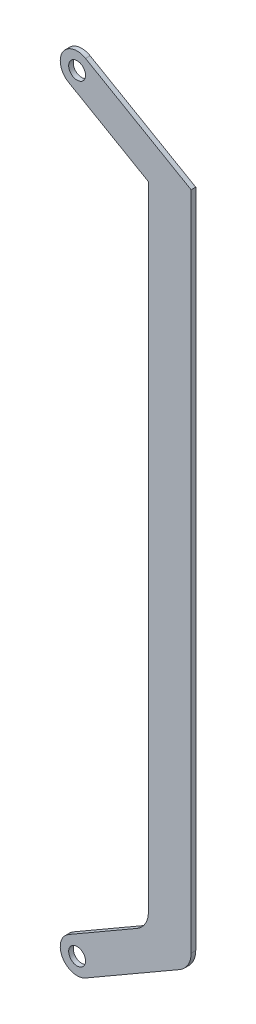
ISO-10303-21;
HEADER;
FILE_DESCRIPTION(('STEP AP214'),'2;1');
FILE_NAME('part.step','',(''),(''),'','','');
FILE_SCHEMA(('AUTOMOTIVE_DESIGN { 1 0 10303 214 1 1 1 1 }'));
ENDSEC;
DATA;
#1=APPLICATION_CONTEXT('core data for automotive mechanical design processes');
#2=APPLICATION_PROTOCOL_DEFINITION('international standard','automotive_design',2000,#1);
#3=PRODUCT_CONTEXT('',#1,'mechanical');
#4=PRODUCT('Part','Part','',(#3));
#5=PRODUCT_RELATED_PRODUCT_CATEGORY('part','',(#4));
#6=PRODUCT_DEFINITION_FORMATION('','',#4);
#7=PRODUCT_DEFINITION_CONTEXT('part definition',#1,'design');
#8=PRODUCT_DEFINITION('design','',#6,#7);
#9=PRODUCT_DEFINITION_SHAPE('','',#8);
#10=(LENGTH_UNIT() NAMED_UNIT(*) SI_UNIT(.MILLI.,.METRE.));
#11=(NAMED_UNIT(*) PLANE_ANGLE_UNIT() SI_UNIT($,.RADIAN.));
#12=(NAMED_UNIT(*) SI_UNIT($,.STERADIAN.) SOLID_ANGLE_UNIT());
#13=UNCERTAINTY_MEASURE_WITH_UNIT(LENGTH_MEASURE(1.E-05),#10,'distance_accuracy_value','');
#14=(GEOMETRIC_REPRESENTATION_CONTEXT(3) GLOBAL_UNCERTAINTY_ASSIGNED_CONTEXT((#13)) GLOBAL_UNIT_ASSIGNED_CONTEXT((#10,
#11,#12)) REPRESENTATION_CONTEXT('',''));
#15=CARTESIAN_POINT('',(0.,0.,0.));
#16=DIRECTION('',(0.,0.,1.));
#17=DIRECTION('',(1.,0.,0.));
#18=AXIS2_PLACEMENT_3D('',#15,#16,#17);
#19=CARTESIAN_POINT('',(249.953360513279,475.962931602702,3.));
#20=DIRECTION('',(0.,0.,1.));
#21=DIRECTION('',(1.,0.,0.));
#22=AXIS2_PLACEMENT_3D('',#19,#20,#21);
#23=PLANE('',#22);
#24=CARTESIAN_POINT('',(249.953360513279,475.962931602702,3.));
#25=DIRECTION('',(0.,0.,1.));
#26=DIRECTION('',(1.,0.,0.));
#27=AXIS2_PLACEMENT_3D('',#24,#25,#26);
#28=CIRCLE('',#27,5.50000000000002);
#29=CARTESIAN_POINT('',(255.453360513279,475.962931602702,3.));
#30=VERTEX_POINT('',#29);
#31=EDGE_CURVE('E156',#30,#30,#28,.T.);
#32=ORIENTED_EDGE('',*,*,#31,.F.);
#33=EDGE_LOOP('',(#32));
#34=FACE_BOUND('',#33,.T.);
#35=DIRECTION('',(0.,1.,0.));
#36=VECTOR('',#35,1.);
#37=CARTESIAN_POINT('',(324.289682363527,14.8395751491829,3.));
#38=LINE('',#37,#36);
#39=CARTESIAN_POINT('',(324.289682363527,14.8395751491828,3.));
#40=VERTEX_POINT('',#39);
#41=CARTESIAN_POINT('',(324.289682363527,445.746542094066,3.));
#42=VERTEX_POINT('',#41);
#43=EDGE_CURVE('E105',#40,#42,#38,.T.);
#44=ORIENTED_EDGE('',*,*,#43,.T.);
#45=DIRECTION('',(-0.866025403784438,0.5,0.));
#46=VECTOR('',#45,1.);
#47=CARTESIAN_POINT('',(324.289682363527,445.746542094066,3.));
#48=LINE('',#47,#46);
#49=CARTESIAN_POINT('',(255.453360513279,485.489211044331,3.));
#50=VERTEX_POINT('',#49);
#51=EDGE_CURVE('E241',#42,#50,#48,.T.);
#52=ORIENTED_EDGE('',*,*,#51,.T.);
#53=CARTESIAN_POINT('',(249.953360513279,475.962931602702,3.));
#54=DIRECTION('',(0.,0.,1.));
#55=DIRECTION('',(1.,0.,0.));
#56=AXIS2_PLACEMENT_3D('',#53,#54,#55);
#57=CIRCLE('',#56,11.);
#58=CARTESIAN_POINT('',(244.453360513279,466.436652161073,3.));
#59=VERTEX_POINT('',#58);
#60=EDGE_CURVE('E211',#50,#59,#57,.T.);
#61=ORIENTED_EDGE('',*,*,#60,.T.);
#62=DIRECTION('',(0.866025403784438,-0.5,0.));
#63=VECTOR('',#62,1.);
#64=CARTESIAN_POINT('',(244.453360513279,466.436652161073,3.));
#65=LINE('',#64,#63);
#66=CARTESIAN_POINT('',(296.414884740345,436.436652161073,3.));
#67=VERTEX_POINT('',#66);
#68=EDGE_CURVE('E231',#59,#67,#65,.T.);
#69=ORIENTED_EDGE('',*,*,#68,.T.);
#70=DIRECTION('',(0.,-1.,0.));
#71=VECTOR('',#70,1.);
#72=CARTESIAN_POINT('',(296.414884740345,436.436652161073,3.));
#73=LINE('',#72,#71);
#74=CARTESIAN_POINT('',(296.414884740345,24.149465082176,3.));
#75=VERTEX_POINT('',#74);
#76=EDGE_CURVE('E227',#67,#75,#73,.T.);
#77=ORIENTED_EDGE('',*,*,#76,.T.);
#78=CARTESIAN_POINT('',(281.414884740345,24.1494650821759,3.));
#79=DIRECTION('',(0.,0.,-1.));
#80=DIRECTION('',(1.,0.,0.));
#81=AXIS2_PLACEMENT_3D('',#78,#79,#80);
#82=CIRCLE('',#81,15.);
#83=CARTESIAN_POINT('',(288.914884740345,11.1590840254093,3.));
#84=VERTEX_POINT('',#83);
#85=EDGE_CURVE('E230',#75,#84,#82,.T.);
#86=ORIENTED_EDGE('',*,*,#85,.T.);
#87=DIRECTION('',(-0.866025403784439,-0.5,0.));
#88=VECTOR('',#87,1.);
#89=CARTESIAN_POINT('',(244.453360513279,-14.5107889556685,3.));
#90=LINE('',#89,#88);
#91=CARTESIAN_POINT('',(244.453360513279,-14.5107889556685,3.));
#92=VERTEX_POINT('',#91);
#93=EDGE_CURVE('E131',#84,#92,#90,.T.);
#94=ORIENTED_EDGE('',*,*,#93,.T.);
#95=CARTESIAN_POINT('',(249.953360513279,-24.0370683972973,3.));
#96=DIRECTION('',(0.,0.,1.));
#97=DIRECTION('',(-1.,0.,0.));
#98=AXIS2_PLACEMENT_3D('',#95,#96,#97);
#99=CIRCLE('',#98,11.);
#100=CARTESIAN_POINT('',(255.453360513279,-33.5633478389262,3.));
#101=VERTEX_POINT('',#100);
#102=EDGE_CURVE('E125',#92,#101,#99,.T.);
#103=ORIENTED_EDGE('',*,*,#102,.T.);
#104=DIRECTION('',(0.866025403784439,0.5,0.));
#105=VECTOR('',#104,1.);
#106=CARTESIAN_POINT('',(316.789682363527,1.8491940924162,3.));
#107=LINE('',#106,#105);
#108=CARTESIAN_POINT('',(316.789682363527,1.8491940924162,3.));
#109=VERTEX_POINT('',#108);
#110=EDGE_CURVE('E129',#101,#109,#107,.T.);
#111=ORIENTED_EDGE('',*,*,#110,.T.);
#112=CARTESIAN_POINT('',(309.289682363527,14.8395751491828,3.));
#113=DIRECTION('',(0.,0.,1.));
#114=DIRECTION('',(1.,0.,0.));
#115=AXIS2_PLACEMENT_3D('',#112,#113,#114);
#116=CIRCLE('',#115,15.);
#117=EDGE_CURVE('E57',#109,#40,#116,.T.);
#118=ORIENTED_EDGE('',*,*,#117,.T.);
#119=EDGE_LOOP('',(#44,#52,#61,#69,#77,#86,#94,#103,#111,#118));
#120=FACE_BOUND('',#119,.T.);
#121=CARTESIAN_POINT('',(249.953360513279,-24.0370683972977,3.));
#122=DIRECTION('',(0.,0.,1.));
#123=DIRECTION('',(1.,0.,0.));
#124=AXIS2_PLACEMENT_3D('',#121,#122,#123);
#125=CIRCLE('',#124,5.49999999999999);
#126=CARTESIAN_POINT('',(255.453360513279,-24.0370683972977,3.));
#127=VERTEX_POINT('',#126);
#128=EDGE_CURVE('E250',#127,#127,#125,.T.);
#129=ORIENTED_EDGE('',*,*,#128,.F.);
#130=EDGE_LOOP('',(#129));
#131=FACE_BOUND('',#130,.T.);
#132=ADVANCED_FACE('F39',(#34,#120,#131),#23,.T.);
#133=CARTESIAN_POINT('',(249.953360513279,475.962931602702,0.));
#134=DIRECTION('',(0.,0.,1.));
#135=DIRECTION('',(1.,0.,0.));
#136=AXIS2_PLACEMENT_3D('',#133,#134,#135);
#137=PLANE('',#136);
#138=DIRECTION('',(0.,1.,0.));
#139=VECTOR('',#138,1.);
#140=CARTESIAN_POINT('',(324.289682363527,445.746542094066,0.));
#141=LINE('',#140,#139);
#142=CARTESIAN_POINT('',(324.289682363527,14.8395751491828,0.));
#143=VERTEX_POINT('',#142);
#144=CARTESIAN_POINT('',(324.289682363527,445.746542094066,0.));
#145=VERTEX_POINT('',#144);
#146=EDGE_CURVE('E99',#143,#145,#141,.T.);
#147=ORIENTED_EDGE('',*,*,#146,.F.);
#148=CARTESIAN_POINT('',(309.289682363527,14.8395751491828,0.));
#149=DIRECTION('',(0.,0.,1.));
#150=DIRECTION('',(1.,0.,0.));
#151=AXIS2_PLACEMENT_3D('',#148,#149,#150);
#152=CIRCLE('',#151,15.);
#153=CARTESIAN_POINT('',(316.789682363527,1.8491940924162,0.));
#154=VERTEX_POINT('',#153);
#155=EDGE_CURVE('E178',#154,#143,#152,.T.);
#156=ORIENTED_EDGE('',*,*,#155,.F.);
#157=DIRECTION('',(0.866025403784439,0.5,0.));
#158=VECTOR('',#157,1.);
#159=CARTESIAN_POINT('',(316.789682363527,1.8491940924162,0.));
#160=LINE('',#159,#158);
#161=CARTESIAN_POINT('',(255.453360513279,-33.5633478389262,0.));
#162=VERTEX_POINT('',#161);
#163=EDGE_CURVE('E92',#162,#154,#160,.T.);
#164=ORIENTED_EDGE('',*,*,#163,.F.);
#165=CARTESIAN_POINT('',(249.953360513279,-24.0370683972973,0.));
#166=DIRECTION('',(0.,0.,1.));
#167=DIRECTION('',(-1.,0.,0.));
#168=AXIS2_PLACEMENT_3D('',#165,#166,#167);
#169=CIRCLE('',#168,11.);
#170=CARTESIAN_POINT('',(244.453360513279,-14.5107889556685,0.));
#171=VERTEX_POINT('',#170);
#172=EDGE_CURVE('E140',#171,#162,#169,.T.);
#173=ORIENTED_EDGE('',*,*,#172,.F.);
#174=DIRECTION('',(-0.866025403784439,-0.5,0.));
#175=VECTOR('',#174,1.);
#176=CARTESIAN_POINT('',(244.453360513279,-14.5107889556685,0.));
#177=LINE('',#176,#175);
#178=CARTESIAN_POINT('',(288.914884740345,11.1590840254093,0.));
#179=VERTEX_POINT('',#178);
#180=EDGE_CURVE('E171',#179,#171,#177,.T.);
#181=ORIENTED_EDGE('',*,*,#180,.F.);
#182=CARTESIAN_POINT('',(281.414884740345,24.1494650821759,0.));
#183=DIRECTION('',(0.,0.,-1.));
#184=DIRECTION('',(1.,0.,0.));
#185=AXIS2_PLACEMENT_3D('',#182,#183,#184);
#186=CIRCLE('',#185,15.);
#187=CARTESIAN_POINT('',(296.414884740345,24.149465082176,0.));
#188=VERTEX_POINT('',#187);
#189=EDGE_CURVE('E168',#188,#179,#186,.T.);
#190=ORIENTED_EDGE('',*,*,#189,.F.);
#191=DIRECTION('',(0.,-1.,0.));
#192=VECTOR('',#191,1.);
#193=CARTESIAN_POINT('',(296.414884740345,436.436652161073,0.));
#194=LINE('',#193,#192);
#195=CARTESIAN_POINT('',(296.414884740345,436.436652161073,0.));
#196=VERTEX_POINT('',#195);
#197=EDGE_CURVE('E165',#196,#188,#194,.T.);
#198=ORIENTED_EDGE('',*,*,#197,.F.);
#199=DIRECTION('',(0.866025403784438,-0.5,0.));
#200=VECTOR('',#199,1.);
#201=CARTESIAN_POINT('',(244.453360513279,466.436652161073,0.));
#202=LINE('',#201,#200);
#203=CARTESIAN_POINT('',(244.453360513279,466.436652161073,0.));
#204=VERTEX_POINT('',#203);
#205=EDGE_CURVE('E162',#204,#196,#202,.T.);
#206=ORIENTED_EDGE('',*,*,#205,.F.);
#207=CARTESIAN_POINT('',(249.953360513279,475.962931602702,0.));
#208=DIRECTION('',(0.,0.,1.));
#209=DIRECTION('',(1.,0.,0.));
#210=AXIS2_PLACEMENT_3D('',#207,#208,#209);
#211=CIRCLE('',#210,11.);
#212=CARTESIAN_POINT('',(255.453360513279,485.489211044331,0.));
#213=VERTEX_POINT('',#212);
#214=EDGE_CURVE('E159',#213,#204,#211,.T.);
#215=ORIENTED_EDGE('',*,*,#214,.F.);
#216=DIRECTION('',(-0.866025403784438,0.5,0.));
#217=VECTOR('',#216,1.);
#218=CARTESIAN_POINT('',(324.289682363527,445.746542094066,0.));
#219=LINE('',#218,#217);
#220=EDGE_CURVE('E155',#145,#213,#219,.T.);
#221=ORIENTED_EDGE('',*,*,#220,.F.);
#222=EDGE_LOOP('',(#147,#156,#164,#173,#181,#190,#198,#206,#215,#221));
#223=FACE_BOUND('',#222,.T.);
#224=CARTESIAN_POINT('',(249.953360513279,475.962931602702,0.));
#225=DIRECTION('',(0.,0.,1.));
#226=DIRECTION('',(1.,0.,0.));
#227=AXIS2_PLACEMENT_3D('',#224,#225,#226);
#228=CIRCLE('',#227,5.50000000000002);
#229=CARTESIAN_POINT('',(255.453360513279,475.962931602702,0.));
#230=VERTEX_POINT('',#229);
#231=EDGE_CURVE('E246',#230,#230,#228,.T.);
#232=ORIENTED_EDGE('',*,*,#231,.T.);
#233=EDGE_LOOP('',(#232));
#234=FACE_BOUND('',#233,.T.);
#235=CARTESIAN_POINT('',(249.953360513279,-24.0370683972977,0.));
#236=DIRECTION('',(0.,0.,1.));
#237=DIRECTION('',(1.,0.,0.));
#238=AXIS2_PLACEMENT_3D('',#235,#236,#237);
#239=CIRCLE('',#238,5.49999999999999);
#240=CARTESIAN_POINT('',(255.453360513279,-24.0370683972977,0.));
#241=VERTEX_POINT('',#240);
#242=EDGE_CURVE('E254',#241,#241,#239,.T.);
#243=ORIENTED_EDGE('',*,*,#242,.T.);
#244=EDGE_LOOP('',(#243));
#245=FACE_BOUND('',#244,.T.);
#246=ADVANCED_FACE('F215',(#223,#234,#245),#137,.F.);
#247=CARTESIAN_POINT('',(324.289682363527,445.746542094066,3.));
#248=DIRECTION('',(-1.,0.,0.));
#249=DIRECTION('',(0.,-1.,0.));
#250=AXIS2_PLACEMENT_3D('',#247,#248,#249);
#251=PLANE('',#250);
#252=ORIENTED_EDGE('',*,*,#146,.T.);
#253=DIRECTION('',(0.,0.,-1.));
#254=VECTOR('',#253,1.);
#255=CARTESIAN_POINT('',(324.289682363527,445.746542094066,3.));
#256=LINE('',#255,#254);
#257=EDGE_CURVE('E11',#42,#145,#256,.T.);
#258=ORIENTED_EDGE('',*,*,#257,.F.);
#259=ORIENTED_EDGE('',*,*,#43,.F.);
#260=DIRECTION('',(0.,0.,-1.));
#261=VECTOR('',#260,1.);
#262=CARTESIAN_POINT('',(324.289682363527,14.8395751491828,3.));
#263=LINE('',#262,#261);
#264=EDGE_CURVE('E149',#40,#143,#263,.T.);
#265=ORIENTED_EDGE('',*,*,#264,.T.);
#266=EDGE_LOOP('',(#252,#258,#259,#265));
#267=FACE_BOUND('',#266,.T.);
#268=ADVANCED_FACE('F41',(#267),#251,.F.);
#269=CARTESIAN_POINT('',(324.289682363527,445.746542094066,3.));
#270=DIRECTION('',(-0.5,-0.866025403784438,0.));
#271=DIRECTION('',(0.866025403784438,-0.5,0.));
#272=AXIS2_PLACEMENT_3D('',#269,#270,#271);
#273=PLANE('',#272);
#274=ORIENTED_EDGE('',*,*,#220,.T.);
#275=DIRECTION('',(0.,0.,-1.));
#276=VECTOR('',#275,1.);
#277=CARTESIAN_POINT('',(255.453360513279,485.489211044331,3.));
#278=LINE('',#277,#276);
#279=EDGE_CURVE('E49',#50,#213,#278,.T.);
#280=ORIENTED_EDGE('',*,*,#279,.F.);
#281=ORIENTED_EDGE('',*,*,#51,.F.);
#282=ORIENTED_EDGE('',*,*,#257,.T.);
#283=EDGE_LOOP('',(#274,#280,#281,#282));
#284=FACE_BOUND('',#283,.T.);
#285=ADVANCED_FACE('F297',(#284),#273,.F.);
#286=CARTESIAN_POINT('',(249.953360513279,475.962931602702,3.));
#287=DIRECTION('',(0.,0.,-1.));
#288=DIRECTION('',(-1.,0.,0.));
#289=AXIS2_PLACEMENT_3D('',#286,#287,#288);
#290=CYLINDRICAL_SURFACE('',#289,11.);
#291=ORIENTED_EDGE('',*,*,#214,.T.);
#292=DIRECTION('',(0.,0.,-1.));
#293=VECTOR('',#292,1.);
#294=CARTESIAN_POINT('',(244.453360513279,466.436652161073,3.));
#295=LINE('',#294,#293);
#296=EDGE_CURVE('E200',#59,#204,#295,.T.);
#297=ORIENTED_EDGE('',*,*,#296,.F.);
#298=ORIENTED_EDGE('',*,*,#60,.F.);
#299=ORIENTED_EDGE('',*,*,#279,.T.);
#300=EDGE_LOOP('',(#291,#297,#298,#299));
#301=FACE_BOUND('',#300,.T.);
#302=ADVANCED_FACE('F209',(#301),#290,.T.);
#303=CARTESIAN_POINT('',(244.453360513279,466.436652161073,3.));
#304=DIRECTION('',(0.5,0.866025403784438,0.));
#305=DIRECTION('',(-0.866025403784439,0.5,0.));
#306=AXIS2_PLACEMENT_3D('',#303,#304,#305);
#307=PLANE('',#306);
#308=ORIENTED_EDGE('',*,*,#205,.T.);
#309=DIRECTION('',(0.,0.,-1.));
#310=VECTOR('',#309,1.);
#311=CARTESIAN_POINT('',(296.414884740345,436.436652161073,3.));
#312=LINE('',#311,#310);
#313=EDGE_CURVE('E196',#67,#196,#312,.T.);
#314=ORIENTED_EDGE('',*,*,#313,.F.);
#315=ORIENTED_EDGE('',*,*,#68,.F.);
#316=ORIENTED_EDGE('',*,*,#296,.T.);
#317=EDGE_LOOP('',(#308,#314,#315,#316));
#318=FACE_BOUND('',#317,.T.);
#319=ADVANCED_FACE('F221',(#318),#307,.F.);
#320=CARTESIAN_POINT('',(296.414884740345,436.436652161073,3.));
#321=DIRECTION('',(1.,0.,0.));
#322=DIRECTION('',(0.,0.,-1.));
#323=AXIS2_PLACEMENT_3D('',#320,#321,#322);
#324=PLANE('',#323);
#325=ORIENTED_EDGE('',*,*,#197,.T.);
#326=DIRECTION('',(0.,0.,-1.));
#327=VECTOR('',#326,1.);
#328=CARTESIAN_POINT('',(296.414884740345,24.149465082176,3.));
#329=LINE('',#328,#327);
#330=EDGE_CURVE('E192',#75,#188,#329,.T.);
#331=ORIENTED_EDGE('',*,*,#330,.F.);
#332=ORIENTED_EDGE('',*,*,#76,.F.);
#333=ORIENTED_EDGE('',*,*,#313,.T.);
#334=EDGE_LOOP('',(#325,#331,#332,#333));
#335=FACE_BOUND('',#334,.T.);
#336=ADVANCED_FACE('F225',(#335),#324,.F.);
#337=CARTESIAN_POINT('',(281.414884740345,24.1494650821759,3.));
#338=DIRECTION('',(0.,0.,-1.));
#339=DIRECTION('',(-1.,0.,0.));
#340=AXIS2_PLACEMENT_3D('',#337,#338,#339);
#341=CYLINDRICAL_SURFACE('',#340,15.);
#342=ORIENTED_EDGE('',*,*,#189,.T.);
#343=DIRECTION('',(0.,0.,-1.));
#344=VECTOR('',#343,1.);
#345=CARTESIAN_POINT('',(288.914884740345,11.1590840254093,3.));
#346=LINE('',#345,#344);
#347=EDGE_CURVE('E188',#84,#179,#346,.T.);
#348=ORIENTED_EDGE('',*,*,#347,.F.);
#349=ORIENTED_EDGE('',*,*,#85,.F.);
#350=ORIENTED_EDGE('',*,*,#330,.T.);
#351=EDGE_LOOP('',(#342,#348,#349,#350));
#352=FACE_BOUND('',#351,.T.);
#353=ADVANCED_FACE('F287',(#352),#341,.F.);
#354=CARTESIAN_POINT('',(244.453360513279,-14.5107889556685,3.));
#355=DIRECTION('',(0.5,-0.866025403784438,0.));
#356=DIRECTION('',(0.866025403784439,0.5,0.));
#357=AXIS2_PLACEMENT_3D('',#354,#355,#356);
#358=PLANE('',#357);
#359=ORIENTED_EDGE('',*,*,#180,.T.);
#360=DIRECTION('',(0.,0.,-1.));
#361=VECTOR('',#360,1.);
#362=CARTESIAN_POINT('',(244.453360513279,-14.5107889556685,3.));
#363=LINE('',#362,#361);
#364=EDGE_CURVE('E142',#92,#171,#363,.T.);
#365=ORIENTED_EDGE('',*,*,#364,.F.);
#366=ORIENTED_EDGE('',*,*,#93,.F.);
#367=ORIENTED_EDGE('',*,*,#347,.T.);
#368=EDGE_LOOP('',(#359,#365,#366,#367));
#369=FACE_BOUND('',#368,.T.);
#370=ADVANCED_FACE('F284',(#369),#358,.F.);
#371=CARTESIAN_POINT('',(249.953360513279,-24.0370683972973,3.));
#372=DIRECTION('',(0.,0.,-1.));
#373=DIRECTION('',(-1.,0.,0.));
#374=AXIS2_PLACEMENT_3D('',#371,#372,#373);
#375=CYLINDRICAL_SURFACE('',#374,11.);
#376=ORIENTED_EDGE('',*,*,#172,.T.);
#377=DIRECTION('',(0.,0.,-1.));
#378=VECTOR('',#377,1.);
#379=CARTESIAN_POINT('',(255.453360513279,-33.5633478389262,3.));
#380=LINE('',#379,#378);
#381=EDGE_CURVE('E137',#101,#162,#380,.T.);
#382=ORIENTED_EDGE('',*,*,#381,.F.);
#383=ORIENTED_EDGE('',*,*,#102,.F.);
#384=ORIENTED_EDGE('',*,*,#364,.T.);
#385=EDGE_LOOP('',(#376,#382,#383,#384));
#386=FACE_BOUND('',#385,.T.);
#387=ADVANCED_FACE('F138',(#386),#375,.T.);
#388=CARTESIAN_POINT('',(316.789682363527,1.8491940924162,3.));
#389=DIRECTION('',(-0.5,0.866025403784439,0.));
#390=DIRECTION('',(-0.866025403784439,-0.5,0.));
#391=AXIS2_PLACEMENT_3D('',#388,#389,#390);
#392=PLANE('',#391);
#393=ORIENTED_EDGE('',*,*,#163,.T.);
#394=DIRECTION('',(0.,0.,-1.));
#395=VECTOR('',#394,1.);
#396=CARTESIAN_POINT('',(316.789682363527,1.8491940924162,3.));
#397=LINE('',#396,#395);
#398=EDGE_CURVE('E143',#109,#154,#397,.T.);
#399=ORIENTED_EDGE('',*,*,#398,.F.);
#400=ORIENTED_EDGE('',*,*,#110,.F.);
#401=ORIENTED_EDGE('',*,*,#381,.T.);
#402=EDGE_LOOP('',(#393,#399,#400,#401));
#403=FACE_BOUND('',#402,.T.);
#404=ADVANCED_FACE('F145',(#403),#392,.F.);
#405=CARTESIAN_POINT('',(309.289682363527,14.8395751491828,3.));
#406=DIRECTION('',(0.,0.,-1.));
#407=DIRECTION('',(-1.,0.,0.));
#408=AXIS2_PLACEMENT_3D('',#405,#406,#407);
#409=CYLINDRICAL_SURFACE('',#408,15.);
#410=ORIENTED_EDGE('',*,*,#155,.T.);
#411=ORIENTED_EDGE('',*,*,#264,.F.);
#412=ORIENTED_EDGE('',*,*,#117,.F.);
#413=ORIENTED_EDGE('',*,*,#398,.T.);
#414=EDGE_LOOP('',(#410,#411,#412,#413));
#415=FACE_BOUND('',#414,.T.);
#416=ADVANCED_FACE('F276',(#415),#409,.T.);
#417=CARTESIAN_POINT('',(249.953360513279,475.962931602702,3.));
#418=DIRECTION('',(0.,0.,-1.));
#419=DIRECTION('',(-1.,0.,0.));
#420=AXIS2_PLACEMENT_3D('',#417,#418,#419);
#421=CYLINDRICAL_SURFACE('',#420,5.50000000000002);
#422=ORIENTED_EDGE('',*,*,#31,.T.);
#423=EDGE_LOOP('',(#422));
#424=FACE_BOUND('',#423,.T.);
#425=ORIENTED_EDGE('',*,*,#231,.F.);
#426=EDGE_LOOP('',(#425));
#427=FACE_BOUND('',#426,.T.);
#428=ADVANCED_FACE('F273',(#424,#427),#421,.F.);
#429=CARTESIAN_POINT('',(249.953360513279,-24.0370683972977,3.));
#430=DIRECTION('',(0.,0.,-1.));
#431=DIRECTION('',(-1.,0.,0.));
#432=AXIS2_PLACEMENT_3D('',#429,#430,#431);
#433=CYLINDRICAL_SURFACE('',#432,5.49999999999999);
#434=ORIENTED_EDGE('',*,*,#128,.T.);
#435=EDGE_LOOP('',(#434));
#436=FACE_BOUND('',#435,.T.);
#437=ORIENTED_EDGE('',*,*,#242,.F.);
#438=EDGE_LOOP('',(#437));
#439=FACE_BOUND('',#438,.T.);
#440=ADVANCED_FACE('F262',(#436,#439),#433,.F.);
#441=CLOSED_SHELL('',(#132,#246,#268,#285,#302,#319,#336,#353,#370,#387,#404,#416,#428,#440));
#442=MANIFOLD_SOLID_BREP('B2',#441);
#443=ADVANCED_BREP_SHAPE_REPRESENTATION('',(#18,#442),#14);
#444=SHAPE_DEFINITION_REPRESENTATION(#9,#443);
ENDSEC;
END-ISO-10303-21;
